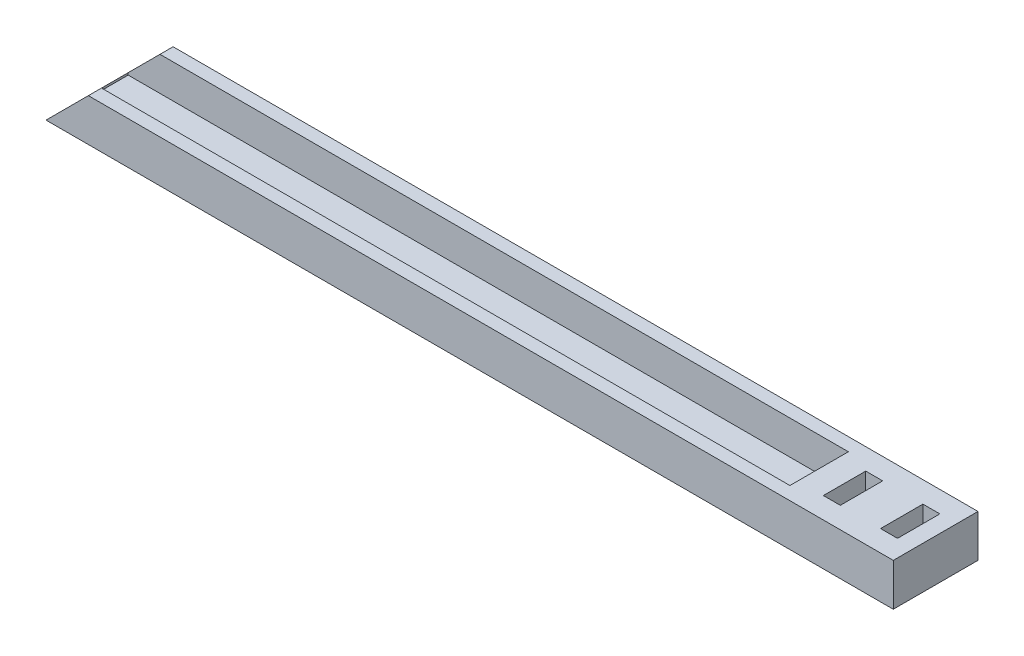
ISO-10303-21;
HEADER;
FILE_DESCRIPTION(('STEP AP214'),'2;1');
FILE_NAME('part.step','',(''),(''),'','','');
FILE_SCHEMA(('AUTOMOTIVE_DESIGN { 1 0 10303 214 1 1 1 1 }'));
ENDSEC;
DATA;
#1=APPLICATION_CONTEXT('core data for automotive mechanical design processes');
#2=APPLICATION_PROTOCOL_DEFINITION('international standard','automotive_design',2000,#1);
#3=PRODUCT_CONTEXT('',#1,'mechanical');
#4=PRODUCT('Part','Part','',(#3));
#5=PRODUCT_RELATED_PRODUCT_CATEGORY('part','',(#4));
#6=PRODUCT_DEFINITION_FORMATION('','',#4);
#7=PRODUCT_DEFINITION_CONTEXT('part definition',#1,'design');
#8=PRODUCT_DEFINITION('design','',#6,#7);
#9=PRODUCT_DEFINITION_SHAPE('','',#8);
#10=(LENGTH_UNIT() NAMED_UNIT(*) SI_UNIT(.MILLI.,.METRE.));
#11=(NAMED_UNIT(*) PLANE_ANGLE_UNIT() SI_UNIT($,.RADIAN.));
#12=(NAMED_UNIT(*) SI_UNIT($,.STERADIAN.) SOLID_ANGLE_UNIT());
#13=UNCERTAINTY_MEASURE_WITH_UNIT(LENGTH_MEASURE(1.E-05),#10,'distance_accuracy_value','');
#14=(GEOMETRIC_REPRESENTATION_CONTEXT(3) GLOBAL_UNCERTAINTY_ASSIGNED_CONTEXT((#13)) GLOBAL_UNIT_ASSIGNED_CONTEXT((#10,
#11,#12)) REPRESENTATION_CONTEXT('',''));
#15=CARTESIAN_POINT('',(0.,0.,0.));
#16=DIRECTION('',(0.,0.,1.));
#17=DIRECTION('',(1.,0.,0.));
#18=AXIS2_PLACEMENT_3D('',#15,#16,#17);
#19=CARTESIAN_POINT('',(0.,12.7,0.));
#20=DIRECTION('',(0.,0.,-1.));
#21=DIRECTION('',(-1.,0.,0.));
#22=AXIS2_PLACEMENT_3D('',#19,#20,#21);
#23=PLANE('',#22);
#24=DIRECTION('',(1.,0.,0.));
#25=VECTOR('',#24,1.);
#26=CARTESIAN_POINT('',(0.,12.7,0.));
#27=LINE('',#26,#25);
#28=CARTESIAN_POINT('',(12.7000000000001,12.7,0.));
#29=VERTEX_POINT('',#28);
#30=CARTESIAN_POINT('',(254.,12.7,0.));
#31=VERTEX_POINT('',#30);
#32=EDGE_CURVE('E266',#29,#31,#27,.T.);
#33=ORIENTED_EDGE('',*,*,#32,.F.);
#34=DIRECTION('',(-0.707106781186551,-0.707106781186544,0.));
#35=VECTOR('',#34,1.);
#36=CARTESIAN_POINT('',(0.,0.,0.));
#37=LINE('',#36,#35);
#38=CARTESIAN_POINT('',(0.,0.,0.));
#39=VERTEX_POINT('',#38);
#40=EDGE_CURVE('E221',#29,#39,#37,.T.);
#41=ORIENTED_EDGE('',*,*,#40,.T.);
#42=DIRECTION('',(1.,0.,0.));
#43=VECTOR('',#42,1.);
#44=CARTESIAN_POINT('',(0.,0.,0.));
#45=LINE('',#44,#43);
#46=CARTESIAN_POINT('',(254.,0.,0.));
#47=VERTEX_POINT('',#46);
#48=EDGE_CURVE('E276',#39,#47,#45,.T.);
#49=ORIENTED_EDGE('',*,*,#48,.T.);
#50=DIRECTION('',(0.,-1.,0.));
#51=VECTOR('',#50,1.);
#52=CARTESIAN_POINT('',(254.,12.7,0.));
#53=LINE('',#52,#51);
#54=EDGE_CURVE('E41',#31,#47,#53,.T.);
#55=ORIENTED_EDGE('',*,*,#54,.F.);
#56=EDGE_LOOP('',(#33,#41,#49,#55));
#57=FACE_BOUND('',#56,.T.);
#58=ADVANCED_FACE('F34',(#57),#23,.F.);
#59=CARTESIAN_POINT('',(254.,12.7,0.));
#60=DIRECTION('',(-1.,0.,0.));
#61=DIRECTION('',(0.,0.,1.));
#62=AXIS2_PLACEMENT_3D('',#59,#60,#61);
#63=PLANE('',#62);
#64=DIRECTION('',(0.,0.,-1.));
#65=VECTOR('',#64,1.);
#66=CARTESIAN_POINT('',(254.,0.,0.));
#67=LINE('',#66,#65);
#68=CARTESIAN_POINT('',(254.,0.,-25.4));
#69=VERTEX_POINT('',#68);
#70=EDGE_CURVE('E278',#47,#69,#67,.T.);
#71=ORIENTED_EDGE('',*,*,#70,.T.);
#72=DIRECTION('',(0.,-1.,0.));
#73=VECTOR('',#72,1.);
#74=CARTESIAN_POINT('',(254.,12.7,-25.4));
#75=LINE('',#74,#73);
#76=CARTESIAN_POINT('',(254.,12.7,-25.4));
#77=VERTEX_POINT('',#76);
#78=EDGE_CURVE('E274',#77,#69,#75,.T.);
#79=ORIENTED_EDGE('',*,*,#78,.F.);
#80=DIRECTION('',(0.,0.,-1.));
#81=VECTOR('',#80,1.);
#82=CARTESIAN_POINT('',(254.,12.7,0.));
#83=LINE('',#82,#81);
#84=EDGE_CURVE('E268',#31,#77,#83,.T.);
#85=ORIENTED_EDGE('',*,*,#84,.F.);
#86=ORIENTED_EDGE('',*,*,#54,.T.);
#87=EDGE_LOOP('',(#71,#79,#85,#86));
#88=FACE_BOUND('',#87,.T.);
#89=ADVANCED_FACE('F288',(#88),#63,.F.);
#90=CARTESIAN_POINT('',(0.,12.7,-25.4));
#91=DIRECTION('',(0.,0.,1.));
#92=DIRECTION('',(1.,0.,0.));
#93=AXIS2_PLACEMENT_3D('',#90,#91,#92);
#94=PLANE('',#93);
#95=DIRECTION('',(-1.,0.,0.));
#96=VECTOR('',#95,1.);
#97=CARTESIAN_POINT('',(0.,0.,-25.4));
#98=LINE('',#97,#96);
#99=CARTESIAN_POINT('',(0.,0.,-25.4));
#100=VERTEX_POINT('',#99);
#101=EDGE_CURVE('E269',#69,#100,#98,.T.);
#102=ORIENTED_EDGE('',*,*,#101,.T.);
#103=DIRECTION('',(-0.707106781186551,-0.707106781186544,0.));
#104=VECTOR('',#103,1.);
#105=CARTESIAN_POINT('',(0.,0.,-25.4));
#106=LINE('',#105,#104);
#107=CARTESIAN_POINT('',(12.7000000000001,12.7,-25.4));
#108=VERTEX_POINT('',#107);
#109=EDGE_CURVE('E188',#108,#100,#106,.T.);
#110=ORIENTED_EDGE('',*,*,#109,.F.);
#111=DIRECTION('',(-1.,0.,0.));
#112=VECTOR('',#111,1.);
#113=CARTESIAN_POINT('',(0.,12.7,-25.4));
#114=LINE('',#113,#112);
#115=EDGE_CURVE('E271',#77,#108,#114,.T.);
#116=ORIENTED_EDGE('',*,*,#115,.F.);
#117=ORIENTED_EDGE('',*,*,#78,.T.);
#118=EDGE_LOOP('',(#102,#110,#116,#117));
#119=FACE_BOUND('',#118,.T.);
#120=ADVANCED_FACE('F299',(#119),#94,.F.);
#121=CARTESIAN_POINT('',(0.,12.7,0.));
#122=DIRECTION('',(0.,-1.,0.));
#123=DIRECTION('',(0.,0.,-1.));
#124=AXIS2_PLACEMENT_3D('',#121,#122,#123);
#125=PLANE('',#124);
#126=DIRECTION('',(1.,0.,0.));
#127=VECTOR('',#126,1.);
#128=CARTESIAN_POINT('',(243.84,12.7,-6.34999999999999));
#129=LINE('',#128,#127);
#130=CARTESIAN_POINT('',(243.84,12.7,-6.34999999999999));
#131=VERTEX_POINT('',#130);
#132=CARTESIAN_POINT('',(248.92,12.7,-6.35));
#133=VERTEX_POINT('',#132);
#134=EDGE_CURVE('E181',#131,#133,#129,.T.);
#135=ORIENTED_EDGE('',*,*,#134,.F.);
#136=DIRECTION('',(0.,0.,1.));
#137=VECTOR('',#136,1.);
#138=CARTESIAN_POINT('',(243.84,12.7,-19.05));
#139=LINE('',#138,#137);
#140=CARTESIAN_POINT('',(243.84,12.7,-19.05));
#141=VERTEX_POINT('',#140);
#142=EDGE_CURVE('E48',#141,#131,#139,.T.);
#143=ORIENTED_EDGE('',*,*,#142,.F.);
#144=DIRECTION('',(-1.,0.,0.));
#145=VECTOR('',#144,1.);
#146=CARTESIAN_POINT('',(243.84,12.7,-19.05));
#147=LINE('',#146,#145);
#148=CARTESIAN_POINT('',(248.92,12.7,-19.05));
#149=VERTEX_POINT('',#148);
#150=EDGE_CURVE('E172',#149,#141,#147,.T.);
#151=ORIENTED_EDGE('',*,*,#150,.F.);
#152=DIRECTION('',(0.,0.,-1.));
#153=VECTOR('',#152,1.);
#154=CARTESIAN_POINT('',(248.92,12.7,-19.05));
#155=LINE('',#154,#153);
#156=EDGE_CURVE('E175',#133,#149,#155,.T.);
#157=ORIENTED_EDGE('',*,*,#156,.F.);
#158=EDGE_LOOP('',(#135,#143,#151,#157));
#159=FACE_BOUND('',#158,.T.);
#160=DIRECTION('',(1.,0.,0.));
#161=VECTOR('',#160,1.);
#162=CARTESIAN_POINT('',(226.695,12.7,-6.35));
#163=LINE('',#162,#161);
#164=CARTESIAN_POINT('',(226.695,12.7,-6.35));
#165=VERTEX_POINT('',#164);
#166=CARTESIAN_POINT('',(231.775,12.7,-6.35));
#167=VERTEX_POINT('',#166);
#168=EDGE_CURVE('E207',#165,#167,#163,.T.);
#169=ORIENTED_EDGE('',*,*,#168,.F.);
#170=DIRECTION('',(0.,0.,1.));
#171=VECTOR('',#170,1.);
#172=CARTESIAN_POINT('',(226.695,12.7,-19.05));
#173=LINE('',#172,#171);
#174=CARTESIAN_POINT('',(226.695,12.7,-19.05));
#175=VERTEX_POINT('',#174);
#176=EDGE_CURVE('E56',#175,#165,#173,.T.);
#177=ORIENTED_EDGE('',*,*,#176,.F.);
#178=DIRECTION('',(-1.,0.,0.));
#179=VECTOR('',#178,1.);
#180=CARTESIAN_POINT('',(226.695,12.7,-19.05));
#181=LINE('',#180,#179);
#182=CARTESIAN_POINT('',(231.775,12.7,-19.05));
#183=VERTEX_POINT('',#182);
#184=EDGE_CURVE('E196',#183,#175,#181,.T.);
#185=ORIENTED_EDGE('',*,*,#184,.F.);
#186=DIRECTION('',(0.,0.,-1.));
#187=VECTOR('',#186,1.);
#188=CARTESIAN_POINT('',(231.775,12.7,-19.05));
#189=LINE('',#188,#187);
#190=EDGE_CURVE('E210',#167,#183,#189,.T.);
#191=ORIENTED_EDGE('',*,*,#190,.F.);
#192=EDGE_LOOP('',(#169,#177,#185,#191));
#193=FACE_BOUND('',#192,.T.);
#194=ORIENTED_EDGE('',*,*,#115,.T.);
#195=DIRECTION('',(0.,0.,-1.));
#196=VECTOR('',#195,1.);
#197=CARTESIAN_POINT('',(12.7000000000001,12.7,0.));
#198=LINE('',#197,#196);
#199=CARTESIAN_POINT('',(12.7000000000001,12.7,-21.463));
#200=VERTEX_POINT('',#199);
#201=EDGE_CURVE('E224',#200,#108,#198,.T.);
#202=ORIENTED_EDGE('',*,*,#201,.F.);
#203=DIRECTION('',(-1.,0.,0.));
#204=VECTOR('',#203,1.);
#205=CARTESIAN_POINT('',(3.175,12.7,-21.463));
#206=LINE('',#205,#204);
#207=CARTESIAN_POINT('',(219.075,12.7,-21.463));
#208=VERTEX_POINT('',#207);
#209=EDGE_CURVE('E239',#208,#200,#206,.T.);
#210=ORIENTED_EDGE('',*,*,#209,.F.);
#211=DIRECTION('',(0.,0.,-1.));
#212=VECTOR('',#211,1.);
#213=CARTESIAN_POINT('',(219.075,12.7,-21.463));
#214=LINE('',#213,#212);
#215=CARTESIAN_POINT('',(219.075,12.7,-3.93699999999997));
#216=VERTEX_POINT('',#215);
#217=EDGE_CURVE('E250',#216,#208,#214,.T.);
#218=ORIENTED_EDGE('',*,*,#217,.F.);
#219=DIRECTION('',(1.,0.,0.));
#220=VECTOR('',#219,1.);
#221=CARTESIAN_POINT('',(3.175,12.7,-3.93699999999997));
#222=LINE('',#221,#220);
#223=CARTESIAN_POINT('',(12.7000000000001,12.7,-3.93699999999997));
#224=VERTEX_POINT('',#223);
#225=EDGE_CURVE('E234',#224,#216,#222,.T.);
#226=ORIENTED_EDGE('',*,*,#225,.F.);
#227=EDGE_CURVE('E226',#29,#224,#198,.T.);
#228=ORIENTED_EDGE('',*,*,#227,.F.);
#229=ORIENTED_EDGE('',*,*,#32,.T.);
#230=ORIENTED_EDGE('',*,*,#84,.T.);
#231=EDGE_LOOP('',(#194,#202,#210,#218,#226,#228,#229,#230));
#232=FACE_BOUND('',#231,.T.);
#233=ADVANCED_FACE('F303',(#159,#193,#232),#125,.F.);
#234=CARTESIAN_POINT('',(0.,0.,0.));
#235=DIRECTION('',(0.,-1.,0.));
#236=DIRECTION('',(0.,0.,-1.));
#237=AXIS2_PLACEMENT_3D('',#234,#235,#236);
#238=PLANE('',#237);
#239=DIRECTION('',(0.,0.,1.));
#240=VECTOR('',#239,1.);
#241=CARTESIAN_POINT('',(0.,0.,0.));
#242=LINE('',#241,#240);
#243=EDGE_CURVE('E258',#100,#39,#242,.T.);
#244=ORIENTED_EDGE('',*,*,#243,.F.);
#245=ORIENTED_EDGE('',*,*,#101,.F.);
#246=ORIENTED_EDGE('',*,*,#70,.F.);
#247=ORIENTED_EDGE('',*,*,#48,.F.);
#248=EDGE_LOOP('',(#244,#245,#246,#247));
#249=FACE_BOUND('',#248,.T.);
#250=ADVANCED_FACE('F296',(#249),#238,.T.);
#251=CARTESIAN_POINT('',(3.175,2.54,-21.463));
#252=DIRECTION('',(-1.,0.,0.));
#253=DIRECTION('',(0.,0.,1.));
#254=AXIS2_PLACEMENT_3D('',#251,#252,#253);
#255=PLANE('',#254);
#256=DIRECTION('',(0.,1.,0.));
#257=VECTOR('',#256,1.);
#258=CARTESIAN_POINT('',(3.175,2.54,-21.463));
#259=LINE('',#258,#257);
#260=CARTESIAN_POINT('',(3.175,2.54,-21.463));
#261=VERTEX_POINT('',#260);
#262=CARTESIAN_POINT('',(3.175,3.17499999999998,-21.463));
#263=VERTEX_POINT('',#262);
#264=EDGE_CURVE('E255',#261,#263,#259,.T.);
#265=ORIENTED_EDGE('',*,*,#264,.T.);
#266=DIRECTION('',(0.,0.,1.));
#267=VECTOR('',#266,1.);
#268=CARTESIAN_POINT('',(3.175,3.17499999999998,-21.463));
#269=LINE('',#268,#267);
#270=CARTESIAN_POINT('',(3.175,3.17499999999998,-3.93699999999997));
#271=VERTEX_POINT('',#270);
#272=EDGE_CURVE('E228',#263,#271,#269,.T.);
#273=ORIENTED_EDGE('',*,*,#272,.T.);
#274=DIRECTION('',(0.,1.,0.));
#275=VECTOR('',#274,1.);
#276=CARTESIAN_POINT('',(3.175,2.54,-3.93699999999997));
#277=LINE('',#276,#275);
#278=CARTESIAN_POINT('',(3.175,2.54,-3.93699999999997));
#279=VERTEX_POINT('',#278);
#280=EDGE_CURVE('E248',#279,#271,#277,.T.);
#281=ORIENTED_EDGE('',*,*,#280,.F.);
#282=DIRECTION('',(0.,0.,1.));
#283=VECTOR('',#282,1.);
#284=CARTESIAN_POINT('',(3.175,2.54,-21.463));
#285=LINE('',#284,#283);
#286=EDGE_CURVE('E235',#261,#279,#285,.T.);
#287=ORIENTED_EDGE('',*,*,#286,.F.);
#288=EDGE_LOOP('',(#265,#273,#281,#287));
#289=FACE_BOUND('',#288,.T.);
#290=ADVANCED_FACE('F314',(#289),#255,.F.);
#291=CARTESIAN_POINT('',(3.175,2.54,-21.463));
#292=DIRECTION('',(0.,0.,-1.));
#293=DIRECTION('',(-1.,0.,0.));
#294=AXIS2_PLACEMENT_3D('',#291,#292,#293);
#295=PLANE('',#294);
#296=ORIENTED_EDGE('',*,*,#209,.T.);
#297=DIRECTION('',(-0.707106781186551,-0.707106781186544,0.));
#298=VECTOR('',#297,1.);
#299=CARTESIAN_POINT('',(2.85750000000001,2.85749999999999,-21.463));
#300=LINE('',#299,#298);
#301=EDGE_CURVE('E231',#200,#263,#300,.T.);
#302=ORIENTED_EDGE('',*,*,#301,.T.);
#303=ORIENTED_EDGE('',*,*,#264,.F.);
#304=DIRECTION('',(-1.,0.,0.));
#305=VECTOR('',#304,1.);
#306=CARTESIAN_POINT('',(3.175,2.54,-21.463));
#307=LINE('',#306,#305);
#308=CARTESIAN_POINT('',(219.075,2.54,-21.463));
#309=VERTEX_POINT('',#308);
#310=EDGE_CURVE('E245',#309,#261,#307,.T.);
#311=ORIENTED_EDGE('',*,*,#310,.F.);
#312=DIRECTION('',(0.,1.,0.));
#313=VECTOR('',#312,1.);
#314=CARTESIAN_POINT('',(219.075,2.54,-21.463));
#315=LINE('',#314,#313);
#316=EDGE_CURVE('E259',#309,#208,#315,.T.);
#317=ORIENTED_EDGE('',*,*,#316,.T.);
#318=EDGE_LOOP('',(#296,#302,#303,#311,#317));
#319=FACE_BOUND('',#318,.T.);
#320=ADVANCED_FACE('F310',(#319),#295,.F.);
#321=CARTESIAN_POINT('',(219.075,2.54,-21.463));
#322=DIRECTION('',(1.,0.,0.));
#323=DIRECTION('',(0.,0.,-1.));
#324=AXIS2_PLACEMENT_3D('',#321,#322,#323);
#325=PLANE('',#324);
#326=ORIENTED_EDGE('',*,*,#217,.T.);
#327=ORIENTED_EDGE('',*,*,#316,.F.);
#328=DIRECTION('',(0.,0.,-1.));
#329=VECTOR('',#328,1.);
#330=CARTESIAN_POINT('',(219.075,2.54,-21.463));
#331=LINE('',#330,#329);
#332=CARTESIAN_POINT('',(219.075,2.54,-3.93699999999997));
#333=VERTEX_POINT('',#332);
#334=EDGE_CURVE('E242',#333,#309,#331,.T.);
#335=ORIENTED_EDGE('',*,*,#334,.F.);
#336=DIRECTION('',(0.,1.,0.));
#337=VECTOR('',#336,1.);
#338=CARTESIAN_POINT('',(219.075,2.54,-3.93699999999997));
#339=LINE('',#338,#337);
#340=EDGE_CURVE('E261',#333,#216,#339,.T.);
#341=ORIENTED_EDGE('',*,*,#340,.T.);
#342=EDGE_LOOP('',(#326,#327,#335,#341));
#343=FACE_BOUND('',#342,.T.);
#344=ADVANCED_FACE('F321',(#343),#325,.F.);
#345=CARTESIAN_POINT('',(3.175,2.54,-3.93699999999997));
#346=DIRECTION('',(0.,0.,1.));
#347=DIRECTION('',(1.,0.,0.));
#348=AXIS2_PLACEMENT_3D('',#345,#346,#347);
#349=PLANE('',#348);
#350=ORIENTED_EDGE('',*,*,#280,.T.);
#351=DIRECTION('',(0.707106781186551,0.707106781186544,0.));
#352=VECTOR('',#351,1.);
#353=CARTESIAN_POINT('',(2.85750000000001,2.85749999999999,-3.93699999999997));
#354=LINE('',#353,#352);
#355=EDGE_CURVE('E11',#271,#224,#354,.T.);
#356=ORIENTED_EDGE('',*,*,#355,.T.);
#357=ORIENTED_EDGE('',*,*,#225,.T.);
#358=ORIENTED_EDGE('',*,*,#340,.F.);
#359=DIRECTION('',(1.,0.,0.));
#360=VECTOR('',#359,1.);
#361=CARTESIAN_POINT('',(3.175,2.54,-3.93699999999997));
#362=LINE('',#361,#360);
#363=EDGE_CURVE('E238',#279,#333,#362,.T.);
#364=ORIENTED_EDGE('',*,*,#363,.F.);
#365=EDGE_LOOP('',(#350,#356,#357,#358,#364));
#366=FACE_BOUND('',#365,.T.);
#367=ADVANCED_FACE('F323',(#366),#349,.F.);
#368=CARTESIAN_POINT('',(0.,2.54,0.));
#369=DIRECTION('',(0.,1.,0.));
#370=DIRECTION('',(0.,0.,1.));
#371=AXIS2_PLACEMENT_3D('',#368,#369,#370);
#372=PLANE('',#371);
#373=ORIENTED_EDGE('',*,*,#286,.T.);
#374=ORIENTED_EDGE('',*,*,#363,.T.);
#375=ORIENTED_EDGE('',*,*,#334,.T.);
#376=ORIENTED_EDGE('',*,*,#310,.T.);
#377=EDGE_LOOP('',(#373,#374,#375,#376));
#378=FACE_BOUND('',#377,.T.);
#379=ADVANCED_FACE('F317',(#378),#372,.T.);
#380=CARTESIAN_POINT('',(0.,0.,0.));
#381=DIRECTION('',(0.707106781186543,-0.707106781186551,0.));
#382=DIRECTION('',(0.707106781186551,0.707106781186544,0.));
#383=AXIS2_PLACEMENT_3D('',#380,#381,#382);
#384=PLANE('',#383);
#385=ORIENTED_EDGE('',*,*,#201,.T.);
#386=ORIENTED_EDGE('',*,*,#109,.T.);
#387=ORIENTED_EDGE('',*,*,#243,.T.);
#388=ORIENTED_EDGE('',*,*,#40,.F.);
#389=ORIENTED_EDGE('',*,*,#227,.T.);
#390=ORIENTED_EDGE('',*,*,#355,.F.);
#391=ORIENTED_EDGE('',*,*,#272,.F.);
#392=ORIENTED_EDGE('',*,*,#301,.F.);
#393=EDGE_LOOP('',(#385,#386,#387,#388,#389,#390,#391,#392));
#394=FACE_BOUND('',#393,.T.);
#395=ADVANCED_FACE('F308',(#394),#384,.F.);
#396=CARTESIAN_POINT('',(226.695,2.54,-19.05));
#397=DIRECTION('',(-1.,0.,0.));
#398=DIRECTION('',(0.,0.,1.));
#399=AXIS2_PLACEMENT_3D('',#396,#397,#398);
#400=PLANE('',#399);
#401=ORIENTED_EDGE('',*,*,#176,.T.);
#402=DIRECTION('',(0.,1.,0.));
#403=VECTOR('',#402,1.);
#404=CARTESIAN_POINT('',(226.695,2.54,-6.35));
#405=LINE('',#404,#403);
#406=CARTESIAN_POINT('',(226.695,2.54,-6.35));
#407=VERTEX_POINT('',#406);
#408=EDGE_CURVE('E205',#407,#165,#405,.T.);
#409=ORIENTED_EDGE('',*,*,#408,.F.);
#410=DIRECTION('',(0.,0.,1.));
#411=VECTOR('',#410,1.);
#412=CARTESIAN_POINT('',(226.695,2.54,-19.05));
#413=LINE('',#412,#411);
#414=CARTESIAN_POINT('',(226.695,2.54,-19.05));
#415=VERTEX_POINT('',#414);
#416=EDGE_CURVE('E192',#415,#407,#413,.T.);
#417=ORIENTED_EDGE('',*,*,#416,.F.);
#418=DIRECTION('',(0.,1.,0.));
#419=VECTOR('',#418,1.);
#420=CARTESIAN_POINT('',(226.695,2.54,-19.05));
#421=LINE('',#420,#419);
#422=EDGE_CURVE('E182',#415,#175,#421,.T.);
#423=ORIENTED_EDGE('',*,*,#422,.T.);
#424=EDGE_LOOP('',(#401,#409,#417,#423));
#425=FACE_BOUND('',#424,.T.);
#426=ADVANCED_FACE('F356',(#425),#400,.F.);
#427=CARTESIAN_POINT('',(226.695,2.54,-19.05));
#428=DIRECTION('',(0.,0.,-1.));
#429=DIRECTION('',(-1.,0.,0.));
#430=AXIS2_PLACEMENT_3D('',#427,#428,#429);
#431=PLANE('',#430);
#432=ORIENTED_EDGE('',*,*,#184,.T.);
#433=ORIENTED_EDGE('',*,*,#422,.F.);
#434=DIRECTION('',(-1.,0.,0.));
#435=VECTOR('',#434,1.);
#436=CARTESIAN_POINT('',(226.695,2.54,-19.05));
#437=LINE('',#436,#435);
#438=CARTESIAN_POINT('',(231.775,2.54,-19.05));
#439=VERTEX_POINT('',#438);
#440=EDGE_CURVE('E202',#439,#415,#437,.T.);
#441=ORIENTED_EDGE('',*,*,#440,.F.);
#442=DIRECTION('',(0.,1.,0.));
#443=VECTOR('',#442,1.);
#444=CARTESIAN_POINT('',(231.775,2.54,-19.05));
#445=LINE('',#444,#443);
#446=EDGE_CURVE('E216',#439,#183,#445,.T.);
#447=ORIENTED_EDGE('',*,*,#446,.T.);
#448=EDGE_LOOP('',(#432,#433,#441,#447));
#449=FACE_BOUND('',#448,.T.);
#450=ADVANCED_FACE('F359',(#449),#431,.F.);
#451=CARTESIAN_POINT('',(231.775,2.54,-19.05));
#452=DIRECTION('',(1.,0.,0.));
#453=DIRECTION('',(0.,0.,-1.));
#454=AXIS2_PLACEMENT_3D('',#451,#452,#453);
#455=PLANE('',#454);
#456=ORIENTED_EDGE('',*,*,#190,.T.);
#457=ORIENTED_EDGE('',*,*,#446,.F.);
#458=DIRECTION('',(0.,0.,-1.));
#459=VECTOR('',#458,1.);
#460=CARTESIAN_POINT('',(231.775,2.54,-19.05));
#461=LINE('',#460,#459);
#462=CARTESIAN_POINT('',(231.775,2.54,-6.35));
#463=VERTEX_POINT('',#462);
#464=EDGE_CURVE('E199',#463,#439,#461,.T.);
#465=ORIENTED_EDGE('',*,*,#464,.F.);
#466=DIRECTION('',(0.,1.,0.));
#467=VECTOR('',#466,1.);
#468=CARTESIAN_POINT('',(231.775,2.54,-6.35));
#469=LINE('',#468,#467);
#470=EDGE_CURVE('E218',#463,#167,#469,.T.);
#471=ORIENTED_EDGE('',*,*,#470,.T.);
#472=EDGE_LOOP('',(#456,#457,#465,#471));
#473=FACE_BOUND('',#472,.T.);
#474=ADVANCED_FACE('F364',(#473),#455,.F.);
#475=CARTESIAN_POINT('',(226.695,2.54,-6.35));
#476=DIRECTION('',(0.,0.,1.));
#477=DIRECTION('',(1.,0.,0.));
#478=AXIS2_PLACEMENT_3D('',#475,#476,#477);
#479=PLANE('',#478);
#480=ORIENTED_EDGE('',*,*,#168,.T.);
#481=ORIENTED_EDGE('',*,*,#470,.F.);
#482=DIRECTION('',(1.,0.,0.));
#483=VECTOR('',#482,1.);
#484=CARTESIAN_POINT('',(226.695,2.54,-6.35));
#485=LINE('',#484,#483);
#486=EDGE_CURVE('E195',#407,#463,#485,.T.);
#487=ORIENTED_EDGE('',*,*,#486,.F.);
#488=ORIENTED_EDGE('',*,*,#408,.T.);
#489=EDGE_LOOP('',(#480,#481,#487,#488));
#490=FACE_BOUND('',#489,.T.);
#491=ADVANCED_FACE('F360',(#490),#479,.F.);
#492=CARTESIAN_POINT('',(0.,2.54,0.));
#493=DIRECTION('',(0.,1.,0.));
#494=DIRECTION('',(0.,0.,1.));
#495=AXIS2_PLACEMENT_3D('',#492,#493,#494);
#496=PLANE('',#495);
#497=ORIENTED_EDGE('',*,*,#416,.T.);
#498=ORIENTED_EDGE('',*,*,#486,.T.);
#499=ORIENTED_EDGE('',*,*,#464,.T.);
#500=ORIENTED_EDGE('',*,*,#440,.T.);
#501=EDGE_LOOP('',(#497,#498,#499,#500));
#502=FACE_BOUND('',#501,.T.);
#503=ADVANCED_FACE('F363',(#502),#496,.T.);
#504=CARTESIAN_POINT('',(243.84,2.54,-19.05));
#505=DIRECTION('',(-1.,0.,0.));
#506=DIRECTION('',(0.,0.,1.));
#507=AXIS2_PLACEMENT_3D('',#504,#505,#506);
#508=PLANE('',#507);
#509=ORIENTED_EDGE('',*,*,#142,.T.);
#510=DIRECTION('',(0.,1.,0.));
#511=VECTOR('',#510,1.);
#512=CARTESIAN_POINT('',(243.84,2.54,-6.34999999999999));
#513=LINE('',#512,#511);
#514=CARTESIAN_POINT('',(243.84,2.54,-6.34999999999999));
#515=VERTEX_POINT('',#514);
#516=EDGE_CURVE('E150',#515,#131,#513,.T.);
#517=ORIENTED_EDGE('',*,*,#516,.F.);
#518=DIRECTION('',(0.,0.,1.));
#519=VECTOR('',#518,1.);
#520=CARTESIAN_POINT('',(243.84,2.54,-19.05));
#521=LINE('',#520,#519);
#522=CARTESIAN_POINT('',(243.84,2.54,-19.05));
#523=VERTEX_POINT('',#522);
#524=EDGE_CURVE('E154',#523,#515,#521,.T.);
#525=ORIENTED_EDGE('',*,*,#524,.F.);
#526=DIRECTION('',(0.,1.,0.));
#527=VECTOR('',#526,1.);
#528=CARTESIAN_POINT('',(243.84,2.54,-19.05));
#529=LINE('',#528,#527);
#530=EDGE_CURVE('E186',#523,#141,#529,.T.);
#531=ORIENTED_EDGE('',*,*,#530,.T.);
#532=EDGE_LOOP('',(#509,#517,#525,#531));
#533=FACE_BOUND('',#532,.T.);
#534=ADVANCED_FACE('F152',(#533),#508,.F.);
#535=CARTESIAN_POINT('',(243.84,2.54,-19.05));
#536=DIRECTION('',(0.,0.,-1.));
#537=DIRECTION('',(-1.,0.,0.));
#538=AXIS2_PLACEMENT_3D('',#535,#536,#537);
#539=PLANE('',#538);
#540=ORIENTED_EDGE('',*,*,#150,.T.);
#541=ORIENTED_EDGE('',*,*,#530,.F.);
#542=DIRECTION('',(-1.,0.,0.));
#543=VECTOR('',#542,1.);
#544=CARTESIAN_POINT('',(243.84,2.54,-19.05));
#545=LINE('',#544,#543);
#546=CARTESIAN_POINT('',(248.92,2.54,-19.05));
#547=VERTEX_POINT('',#546);
#548=EDGE_CURVE('E160',#547,#523,#545,.T.);
#549=ORIENTED_EDGE('',*,*,#548,.F.);
#550=DIRECTION('',(0.,1.,0.));
#551=VECTOR('',#550,1.);
#552=CARTESIAN_POINT('',(248.92,2.54,-19.05));
#553=LINE('',#552,#551);
#554=EDGE_CURVE('E189',#547,#149,#553,.T.);
#555=ORIENTED_EDGE('',*,*,#554,.T.);
#556=EDGE_LOOP('',(#540,#541,#549,#555));
#557=FACE_BOUND('',#556,.T.);
#558=ADVANCED_FACE('F377',(#557),#539,.F.);
#559=CARTESIAN_POINT('',(248.92,2.54,-19.05));
#560=DIRECTION('',(1.,0.,0.));
#561=DIRECTION('',(0.,0.,-1.));
#562=AXIS2_PLACEMENT_3D('',#559,#560,#561);
#563=PLANE('',#562);
#564=ORIENTED_EDGE('',*,*,#156,.T.);
#565=ORIENTED_EDGE('',*,*,#554,.F.);
#566=DIRECTION('',(0.,0.,-1.));
#567=VECTOR('',#566,1.);
#568=CARTESIAN_POINT('',(248.92,2.54,-19.05));
#569=LINE('',#568,#567);
#570=CARTESIAN_POINT('',(248.92,2.54,-6.35));
#571=VERTEX_POINT('',#570);
#572=EDGE_CURVE('E168',#571,#547,#569,.T.);
#573=ORIENTED_EDGE('',*,*,#572,.F.);
#574=DIRECTION('',(0.,1.,0.));
#575=VECTOR('',#574,1.);
#576=CARTESIAN_POINT('',(248.92,2.54,-6.35));
#577=LINE('',#576,#575);
#578=EDGE_CURVE('E159',#571,#133,#577,.T.);
#579=ORIENTED_EDGE('',*,*,#578,.T.);
#580=EDGE_LOOP('',(#564,#565,#573,#579));
#581=FACE_BOUND('',#580,.T.);
#582=ADVANCED_FACE('F380',(#581),#563,.F.);
#583=CARTESIAN_POINT('',(243.84,2.54,-6.34999999999999));
#584=DIRECTION('',(0.,0.,1.));
#585=DIRECTION('',(1.,0.,0.));
#586=AXIS2_PLACEMENT_3D('',#583,#584,#585);
#587=PLANE('',#586);
#588=ORIENTED_EDGE('',*,*,#134,.T.);
#589=ORIENTED_EDGE('',*,*,#578,.F.);
#590=DIRECTION('',(1.,0.,0.));
#591=VECTOR('',#590,1.);
#592=CARTESIAN_POINT('',(243.84,2.54,-6.34999999999999));
#593=LINE('',#592,#591);
#594=EDGE_CURVE('E163',#515,#571,#593,.T.);
#595=ORIENTED_EDGE('',*,*,#594,.F.);
#596=ORIENTED_EDGE('',*,*,#516,.T.);
#597=EDGE_LOOP('',(#588,#589,#595,#596));
#598=FACE_BOUND('',#597,.T.);
#599=ADVANCED_FACE('F164',(#598),#587,.F.);
#600=CARTESIAN_POINT('',(0.,2.54,0.));
#601=DIRECTION('',(0.,1.,0.));
#602=DIRECTION('',(0.,0.,1.));
#603=AXIS2_PLACEMENT_3D('',#600,#601,#602);
#604=PLANE('',#603);
#605=ORIENTED_EDGE('',*,*,#524,.T.);
#606=ORIENTED_EDGE('',*,*,#594,.T.);
#607=ORIENTED_EDGE('',*,*,#572,.T.);
#608=ORIENTED_EDGE('',*,*,#548,.T.);
#609=EDGE_LOOP('',(#605,#606,#607,#608));
#610=FACE_BOUND('',#609,.T.);
#611=ADVANCED_FACE('F170',(#610),#604,.T.);
#612=CLOSED_SHELL('',(#58,#89,#120,#233,#250,#290,#320,#344,#367,#379,#395,#426,#450,#474,#491,
#503,#534,#558,#582,#599,#611));
#613=MANIFOLD_SOLID_BREP('B2',#612);
#614=ADVANCED_BREP_SHAPE_REPRESENTATION('',(#18,#613),#14);
#615=SHAPE_DEFINITION_REPRESENTATION(#9,#614);
ENDSEC;
END-ISO-10303-21;
